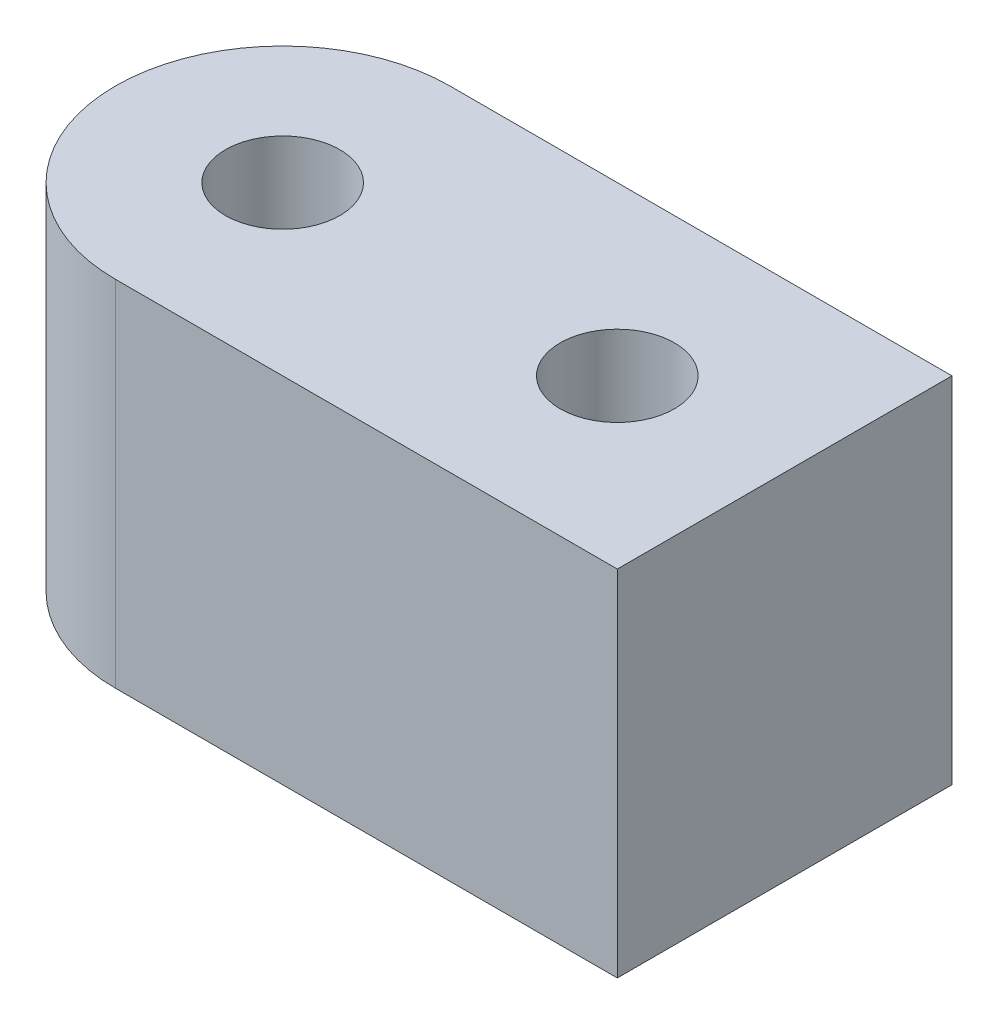
ISO-10303-21;
HEADER;
FILE_DESCRIPTION(('STEP AP214'),'2;1');
FILE_NAME('part.step','',(''),(''),'','','');
FILE_SCHEMA(('AUTOMOTIVE_DESIGN { 1 0 10303 214 1 1 1 1 }'));
ENDSEC;
DATA;
#1=APPLICATION_CONTEXT('core data for automotive mechanical design processes');
#2=APPLICATION_PROTOCOL_DEFINITION('international standard','automotive_design',2000,#1);
#3=PRODUCT_CONTEXT('',#1,'mechanical');
#4=PRODUCT('Part','Part','',(#3));
#5=PRODUCT_RELATED_PRODUCT_CATEGORY('part','',(#4));
#6=PRODUCT_DEFINITION_FORMATION('','',#4);
#7=PRODUCT_DEFINITION_CONTEXT('part definition',#1,'design');
#8=PRODUCT_DEFINITION('design','',#6,#7);
#9=PRODUCT_DEFINITION_SHAPE('','',#8);
#10=(LENGTH_UNIT() NAMED_UNIT(*) SI_UNIT(.MILLI.,.METRE.));
#11=(NAMED_UNIT(*) PLANE_ANGLE_UNIT() SI_UNIT($,.RADIAN.));
#12=(NAMED_UNIT(*) SI_UNIT($,.STERADIAN.) SOLID_ANGLE_UNIT());
#13=UNCERTAINTY_MEASURE_WITH_UNIT(LENGTH_MEASURE(1.E-05),#10,'distance_accuracy_value','');
#14=(GEOMETRIC_REPRESENTATION_CONTEXT(3) GLOBAL_UNCERTAINTY_ASSIGNED_CONTEXT((#13)) GLOBAL_UNIT_ASSIGNED_CONTEXT((#10,
#11,#12)) REPRESENTATION_CONTEXT('',''));
#15=CARTESIAN_POINT('',(0.,0.,0.));
#16=DIRECTION('',(0.,0.,1.));
#17=DIRECTION('',(1.,0.,0.));
#18=AXIS2_PLACEMENT_3D('',#15,#16,#17);
#19=CARTESIAN_POINT('',(-12.,12.7,0.));
#20=DIRECTION('',(0.,1.,0.));
#21=DIRECTION('',(0.,0.,1.));
#22=AXIS2_PLACEMENT_3D('',#19,#20,#21);
#23=PLANE('',#22);
#24=CARTESIAN_POINT('',(0.,12.7,0.));
#25=DIRECTION('',(0.,1.,0.));
#26=DIRECTION('',(0.,0.,1.));
#27=AXIS2_PLACEMENT_3D('',#24,#25,#26);
#28=CIRCLE('',#27,2.05);
#29=CARTESIAN_POINT('',(0.,12.7,2.05));
#30=VERTEX_POINT('',#29);
#31=EDGE_CURVE('E112',#30,#30,#28,.T.);
#32=ORIENTED_EDGE('',*,*,#31,.F.);
#33=EDGE_LOOP('',(#32));
#34=FACE_BOUND('',#33,.T.);
#35=DIRECTION('',(-1.,0.,0.));
#36=VECTOR('',#35,1.);
#37=CARTESIAN_POINT('',(6.,12.7,-6.));
#38=LINE('',#37,#36);
#39=CARTESIAN_POINT('',(6.,12.7,-6.));
#40=VERTEX_POINT('',#39);
#41=CARTESIAN_POINT('',(-12.,12.7,-6.));
#42=VERTEX_POINT('',#41);
#43=EDGE_CURVE('E92',#40,#42,#38,.T.);
#44=ORIENTED_EDGE('',*,*,#43,.T.);
#45=CARTESIAN_POINT('',(-12.,12.7,0.));
#46=DIRECTION('',(0.,1.,0.));
#47=DIRECTION('',(0.,0.,1.));
#48=AXIS2_PLACEMENT_3D('',#45,#46,#47);
#49=CIRCLE('',#48,6.);
#50=CARTESIAN_POINT('',(-12.,12.7,6.));
#51=VERTEX_POINT('',#50);
#52=EDGE_CURVE('E87',#42,#51,#49,.T.);
#53=ORIENTED_EDGE('',*,*,#52,.T.);
#54=DIRECTION('',(1.,0.,0.));
#55=VECTOR('',#54,1.);
#56=CARTESIAN_POINT('',(-12.,12.7,6.));
#57=LINE('',#56,#55);
#58=CARTESIAN_POINT('',(6.,12.7,6.));
#59=VERTEX_POINT('',#58);
#60=EDGE_CURVE('E90',#51,#59,#57,.T.);
#61=ORIENTED_EDGE('',*,*,#60,.T.);
#62=DIRECTION('',(0.,0.,-1.));
#63=VECTOR('',#62,1.);
#64=CARTESIAN_POINT('',(6.,12.7,-6.));
#65=LINE('',#64,#63);
#66=EDGE_CURVE('E57',#59,#40,#65,.T.);
#67=ORIENTED_EDGE('',*,*,#66,.T.);
#68=EDGE_LOOP('',(#44,#53,#61,#67));
#69=FACE_BOUND('',#68,.T.);
#70=CARTESIAN_POINT('',(-12.,12.7,0.));
#71=DIRECTION('',(0.,1.,0.));
#72=DIRECTION('',(0.,0.,1.));
#73=AXIS2_PLACEMENT_3D('',#70,#71,#72);
#74=CIRCLE('',#73,2.05);
#75=CARTESIAN_POINT('',(-12.,12.7,2.05));
#76=VERTEX_POINT('',#75);
#77=EDGE_CURVE('E134',#76,#76,#74,.T.);
#78=ORIENTED_EDGE('',*,*,#77,.F.);
#79=EDGE_LOOP('',(#78));
#80=FACE_BOUND('',#79,.T.);
#81=ADVANCED_FACE('F39',(#34,#69,#80),#23,.T.);
#82=CARTESIAN_POINT('',(-12.,0.,0.));
#83=DIRECTION('',(0.,1.,0.));
#84=DIRECTION('',(0.,0.,1.));
#85=AXIS2_PLACEMENT_3D('',#82,#83,#84);
#86=PLANE('',#85);
#87=DIRECTION('',(-1.,0.,0.));
#88=VECTOR('',#87,1.);
#89=CARTESIAN_POINT('',(6.,0.,-6.));
#90=LINE('',#89,#88);
#91=CARTESIAN_POINT('',(6.,0.,-6.));
#92=VERTEX_POINT('',#91);
#93=CARTESIAN_POINT('',(-12.,0.,-6.));
#94=VERTEX_POINT('',#93);
#95=EDGE_CURVE('E108',#92,#94,#90,.T.);
#96=ORIENTED_EDGE('',*,*,#95,.F.);
#97=DIRECTION('',(0.,0.,-1.));
#98=VECTOR('',#97,1.);
#99=CARTESIAN_POINT('',(6.,0.,-6.));
#100=LINE('',#99,#98);
#101=CARTESIAN_POINT('',(6.,0.,6.));
#102=VERTEX_POINT('',#101);
#103=EDGE_CURVE('E80',#102,#92,#100,.T.);
#104=ORIENTED_EDGE('',*,*,#103,.F.);
#105=DIRECTION('',(1.,0.,0.));
#106=VECTOR('',#105,1.);
#107=CARTESIAN_POINT('',(-12.,0.,6.));
#108=LINE('',#107,#106);
#109=CARTESIAN_POINT('',(-12.,0.,6.));
#110=VERTEX_POINT('',#109);
#111=EDGE_CURVE('E74',#110,#102,#108,.T.);
#112=ORIENTED_EDGE('',*,*,#111,.F.);
#113=CARTESIAN_POINT('',(-12.,0.,0.));
#114=DIRECTION('',(0.,1.,0.));
#115=DIRECTION('',(0.,0.,1.));
#116=AXIS2_PLACEMENT_3D('',#113,#114,#115);
#117=CIRCLE('',#116,6.);
#118=EDGE_CURVE('E97',#94,#110,#117,.T.);
#119=ORIENTED_EDGE('',*,*,#118,.F.);
#120=EDGE_LOOP('',(#96,#104,#112,#119));
#121=FACE_BOUND('',#120,.T.);
#122=CARTESIAN_POINT('',(0.,0.,0.));
#123=DIRECTION('',(0.,1.,0.));
#124=DIRECTION('',(0.,0.,1.));
#125=AXIS2_PLACEMENT_3D('',#122,#123,#124);
#126=CIRCLE('',#125,2.05);
#127=CARTESIAN_POINT('',(0.,0.,2.05));
#128=VERTEX_POINT('',#127);
#129=EDGE_CURVE('E130',#128,#128,#126,.T.);
#130=ORIENTED_EDGE('',*,*,#129,.T.);
#131=EDGE_LOOP('',(#130));
#132=FACE_BOUND('',#131,.T.);
#133=CARTESIAN_POINT('',(-12.,0.,0.));
#134=DIRECTION('',(0.,1.,0.));
#135=DIRECTION('',(0.,0.,1.));
#136=AXIS2_PLACEMENT_3D('',#133,#134,#135);
#137=CIRCLE('',#136,2.05);
#138=CARTESIAN_POINT('',(-12.,0.,2.05));
#139=VERTEX_POINT('',#138);
#140=EDGE_CURVE('E138',#139,#139,#137,.T.);
#141=ORIENTED_EDGE('',*,*,#140,.T.);
#142=EDGE_LOOP('',(#141));
#143=FACE_BOUND('',#142,.T.);
#144=ADVANCED_FACE('F125',(#121,#132,#143),#86,.F.);
#145=CARTESIAN_POINT('',(6.,12.7,-6.));
#146=DIRECTION('',(0.,0.,1.));
#147=DIRECTION('',(1.,0.,0.));
#148=AXIS2_PLACEMENT_3D('',#145,#146,#147);
#149=PLANE('',#148);
#150=ORIENTED_EDGE('',*,*,#95,.T.);
#151=DIRECTION('',(0.,-1.,0.));
#152=VECTOR('',#151,1.);
#153=CARTESIAN_POINT('',(-12.,12.7,-6.));
#154=LINE('',#153,#152);
#155=EDGE_CURVE('E11',#42,#94,#154,.T.);
#156=ORIENTED_EDGE('',*,*,#155,.F.);
#157=ORIENTED_EDGE('',*,*,#43,.F.);
#158=DIRECTION('',(0.,-1.,0.));
#159=VECTOR('',#158,1.);
#160=CARTESIAN_POINT('',(6.,12.7,-6.));
#161=LINE('',#160,#159);
#162=EDGE_CURVE('E104',#40,#92,#161,.T.);
#163=ORIENTED_EDGE('',*,*,#162,.T.);
#164=EDGE_LOOP('',(#150,#156,#157,#163));
#165=FACE_BOUND('',#164,.T.);
#166=ADVANCED_FACE('F41',(#165),#149,.F.);
#167=CARTESIAN_POINT('',(-12.,12.7,0.));
#168=DIRECTION('',(0.,-1.,0.));
#169=DIRECTION('',(0.,0.,-1.));
#170=AXIS2_PLACEMENT_3D('',#167,#168,#169);
#171=CYLINDRICAL_SURFACE('',#170,6.);
#172=ORIENTED_EDGE('',*,*,#118,.T.);
#173=DIRECTION('',(0.,-1.,0.));
#174=VECTOR('',#173,1.);
#175=CARTESIAN_POINT('',(-12.,12.7,6.));
#176=LINE('',#175,#174);
#177=EDGE_CURVE('E49',#51,#110,#176,.T.);
#178=ORIENTED_EDGE('',*,*,#177,.F.);
#179=ORIENTED_EDGE('',*,*,#52,.F.);
#180=ORIENTED_EDGE('',*,*,#155,.T.);
#181=EDGE_LOOP('',(#172,#178,#179,#180));
#182=FACE_BOUND('',#181,.T.);
#183=ADVANCED_FACE('F96',(#182),#171,.T.);
#184=CARTESIAN_POINT('',(-12.,12.7,6.));
#185=DIRECTION('',(0.,0.,-1.));
#186=DIRECTION('',(-1.,0.,0.));
#187=AXIS2_PLACEMENT_3D('',#184,#185,#186);
#188=PLANE('',#187);
#189=ORIENTED_EDGE('',*,*,#111,.T.);
#190=DIRECTION('',(0.,-1.,0.));
#191=VECTOR('',#190,1.);
#192=CARTESIAN_POINT('',(6.,12.7,6.));
#193=LINE('',#192,#191);
#194=EDGE_CURVE('E99',#59,#102,#193,.T.);
#195=ORIENTED_EDGE('',*,*,#194,.F.);
#196=ORIENTED_EDGE('',*,*,#60,.F.);
#197=ORIENTED_EDGE('',*,*,#177,.T.);
#198=EDGE_LOOP('',(#189,#195,#196,#197));
#199=FACE_BOUND('',#198,.T.);
#200=ADVANCED_FACE('F100',(#199),#188,.F.);
#201=CARTESIAN_POINT('',(6.,12.7,-6.));
#202=DIRECTION('',(-1.,0.,0.));
#203=DIRECTION('',(0.,0.,1.));
#204=AXIS2_PLACEMENT_3D('',#201,#202,#203);
#205=PLANE('',#204);
#206=ORIENTED_EDGE('',*,*,#103,.T.);
#207=ORIENTED_EDGE('',*,*,#162,.F.);
#208=ORIENTED_EDGE('',*,*,#66,.F.);
#209=ORIENTED_EDGE('',*,*,#194,.T.);
#210=EDGE_LOOP('',(#206,#207,#208,#209));
#211=FACE_BOUND('',#210,.T.);
#212=ADVANCED_FACE('F122',(#211),#205,.F.);
#213=CARTESIAN_POINT('',(0.,12.7,0.));
#214=DIRECTION('',(0.,-1.,0.));
#215=DIRECTION('',(0.,0.,-1.));
#216=AXIS2_PLACEMENT_3D('',#213,#214,#215);
#217=CYLINDRICAL_SURFACE('',#216,2.05);
#218=ORIENTED_EDGE('',*,*,#31,.T.);
#219=EDGE_LOOP('',(#218));
#220=FACE_BOUND('',#219,.T.);
#221=ORIENTED_EDGE('',*,*,#129,.F.);
#222=EDGE_LOOP('',(#221));
#223=FACE_BOUND('',#222,.T.);
#224=ADVANCED_FACE('F157',(#220,#223),#217,.F.);
#225=CARTESIAN_POINT('',(-12.,12.7,0.));
#226=DIRECTION('',(0.,-1.,0.));
#227=DIRECTION('',(0.,0.,-1.));
#228=AXIS2_PLACEMENT_3D('',#225,#226,#227);
#229=CYLINDRICAL_SURFACE('',#228,2.05);
#230=ORIENTED_EDGE('',*,*,#77,.T.);
#231=EDGE_LOOP('',(#230));
#232=FACE_BOUND('',#231,.T.);
#233=ORIENTED_EDGE('',*,*,#140,.F.);
#234=EDGE_LOOP('',(#233));
#235=FACE_BOUND('',#234,.T.);
#236=ADVANCED_FACE('F146',(#232,#235),#229,.F.);
#237=CLOSED_SHELL('',(#81,#144,#166,#183,#200,#212,#224,#236));
#238=MANIFOLD_SOLID_BREP('B2',#237);
#239=ADVANCED_BREP_SHAPE_REPRESENTATION('',(#18,#238),#14);
#240=SHAPE_DEFINITION_REPRESENTATION(#9,#239);
ENDSEC;
END-ISO-10303-21;
